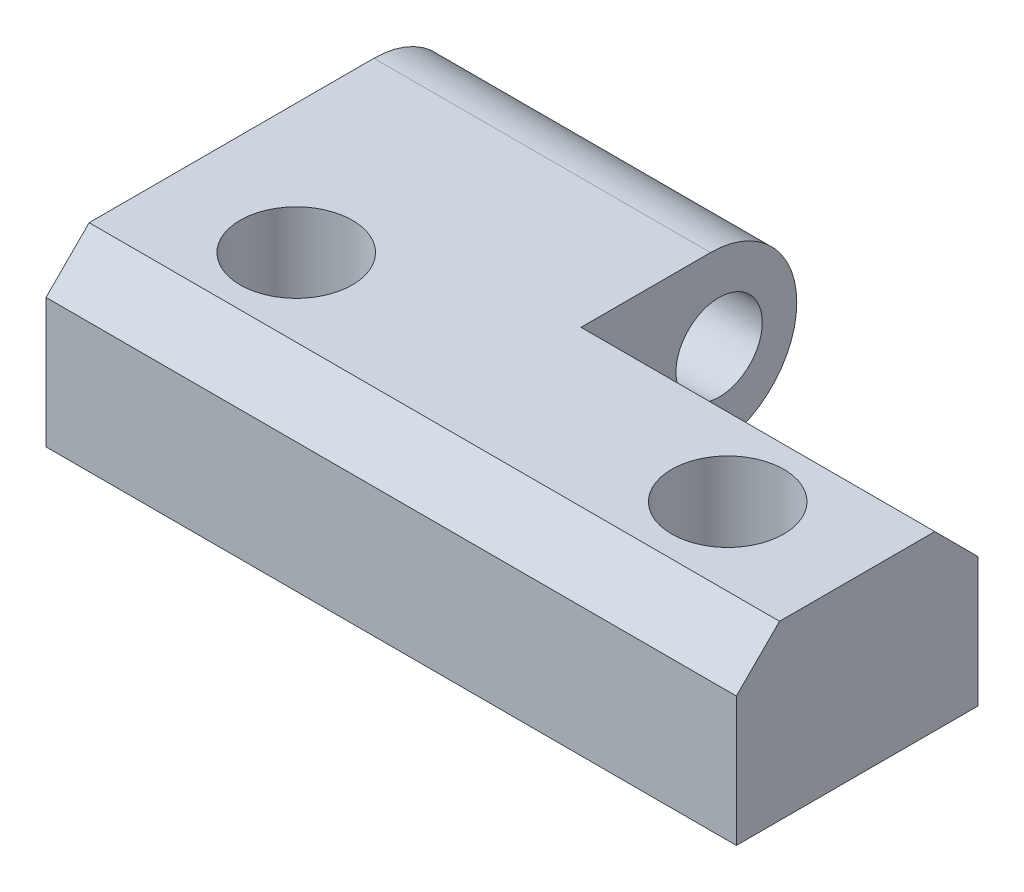
ISO-10303-21;
HEADER;
FILE_DESCRIPTION(('STEP AP214'),'2;1');
FILE_NAME('part.step','',(''),(''),'','','');
FILE_SCHEMA(('AUTOMOTIVE_DESIGN { 1 0 10303 214 1 1 1 1 }'));
ENDSEC;
DATA;
#1=APPLICATION_CONTEXT('core data for automotive mechanical design processes');
#2=APPLICATION_PROTOCOL_DEFINITION('international standard','automotive_design',2000,#1);
#3=PRODUCT_CONTEXT('',#1,'mechanical');
#4=PRODUCT('Part','Part','',(#3));
#5=PRODUCT_RELATED_PRODUCT_CATEGORY('part','',(#4));
#6=PRODUCT_DEFINITION_FORMATION('','',#4);
#7=PRODUCT_DEFINITION_CONTEXT('part definition',#1,'design');
#8=PRODUCT_DEFINITION('design','',#6,#7);
#9=PRODUCT_DEFINITION_SHAPE('','',#8);
#10=(LENGTH_UNIT() NAMED_UNIT(*) SI_UNIT(.MILLI.,.METRE.));
#11=(NAMED_UNIT(*) PLANE_ANGLE_UNIT() SI_UNIT($,.RADIAN.));
#12=(NAMED_UNIT(*) SI_UNIT($,.STERADIAN.) SOLID_ANGLE_UNIT());
#13=UNCERTAINTY_MEASURE_WITH_UNIT(LENGTH_MEASURE(1.E-05),#10,'distance_accuracy_value','');
#14=(GEOMETRIC_REPRESENTATION_CONTEXT(3) GLOBAL_UNCERTAINTY_ASSIGNED_CONTEXT((#13)) GLOBAL_UNIT_ASSIGNED_CONTEXT((#10,
#11,#12)) REPRESENTATION_CONTEXT('',''));
#15=CARTESIAN_POINT('',(0.,0.,0.));
#16=DIRECTION('',(0.,0.,1.));
#17=DIRECTION('',(1.,0.,0.));
#18=AXIS2_PLACEMENT_3D('',#15,#16,#17);
#19=CARTESIAN_POINT('',(0.,10.,0.));
#20=DIRECTION('',(0.,1.,0.));
#21=DIRECTION('',(0.,0.,1.));
#22=AXIS2_PLACEMENT_3D('',#19,#20,#21);
#23=PLANE('',#22);
#24=CARTESIAN_POINT('',(-25.,10.,10.));
#25=DIRECTION('',(0.,1.,0.));
#26=DIRECTION('',(0.,0.,1.));
#27=AXIS2_PLACEMENT_3D('',#24,#25,#26);
#28=CIRCLE('',#27,6.5);
#29=CARTESIAN_POINT('',(-25.,10.,16.5));
#30=VERTEX_POINT('',#29);
#31=EDGE_CURVE('E139',#30,#30,#28,.T.);
#32=ORIENTED_EDGE('',*,*,#31,.F.);
#33=EDGE_LOOP('',(#32));
#34=FACE_BOUND('',#33,.T.);
#35=CARTESIAN_POINT('',(25.,10.,10.));
#36=DIRECTION('',(0.,1.,0.));
#37=DIRECTION('',(0.,0.,1.));
#38=AXIS2_PLACEMENT_3D('',#35,#36,#37);
#39=CIRCLE('',#38,6.5);
#40=CARTESIAN_POINT('',(25.,10.,16.5));
#41=VERTEX_POINT('',#40);
#42=EDGE_CURVE('E326',#41,#41,#39,.T.);
#43=ORIENTED_EDGE('',*,*,#42,.F.);
#44=EDGE_LOOP('',(#43));
#45=FACE_BOUND('',#44,.T.);
#46=DIRECTION('',(0.,0.,-1.));
#47=VECTOR('',#46,1.);
#48=CARTESIAN_POINT('',(40.,10.,24.));
#49=LINE('',#48,#47);
#50=CARTESIAN_POINT('',(40.,10.,19.));
#51=VERTEX_POINT('',#50);
#52=CARTESIAN_POINT('',(40.,10.,1.00000000000001));
#53=VERTEX_POINT('',#52);
#54=EDGE_CURVE('E182',#51,#53,#49,.T.);
#55=ORIENTED_EDGE('',*,*,#54,.T.);
#56=DIRECTION('',(-1.,0.,0.));
#57=VECTOR('',#56,1.);
#58=CARTESIAN_POINT('',(-1.,10.,1.00000000000001));
#59=LINE('',#58,#57);
#60=CARTESIAN_POINT('',(-1.,10.,1.00000000000001));
#61=VERTEX_POINT('',#60);
#62=EDGE_CURVE('E168',#53,#61,#59,.T.);
#63=ORIENTED_EDGE('',*,*,#62,.T.);
#64=DIRECTION('',(0.,0.,-1.));
#65=VECTOR('',#64,1.);
#66=CARTESIAN_POINT('',(-1.,10.,-3.99999999999999));
#67=LINE('',#66,#65);
#68=CARTESIAN_POINT('',(-1.,10.,-14.));
#69=VERTEX_POINT('',#68);
#70=EDGE_CURVE('E147',#61,#69,#67,.T.);
#71=ORIENTED_EDGE('',*,*,#70,.T.);
#72=DIRECTION('',(1.,0.,0.));
#73=VECTOR('',#72,1.);
#74=CARTESIAN_POINT('',(-40.,10.,-14.));
#75=LINE('',#74,#73);
#76=CARTESIAN_POINT('',(-40.,10.,-14.));
#77=VERTEX_POINT('',#76);
#78=EDGE_CURVE('E124',#77,#69,#75,.T.);
#79=ORIENTED_EDGE('',*,*,#78,.F.);
#80=DIRECTION('',(0.,0.,1.));
#81=VECTOR('',#80,1.);
#82=CARTESIAN_POINT('',(-40.,10.,-24.));
#83=LINE('',#82,#81);
#84=CARTESIAN_POINT('',(-40.,10.,19.));
#85=VERTEX_POINT('',#84);
#86=EDGE_CURVE('E133',#77,#85,#83,.T.);
#87=ORIENTED_EDGE('',*,*,#86,.T.);
#88=DIRECTION('',(1.,0.,0.));
#89=VECTOR('',#88,1.);
#90=CARTESIAN_POINT('',(40.,10.,19.));
#91=LINE('',#90,#89);
#92=EDGE_CURVE('E165',#85,#51,#91,.T.);
#93=ORIENTED_EDGE('',*,*,#92,.T.);
#94=EDGE_LOOP('',(#55,#63,#71,#79,#87,#93));
#95=FACE_BOUND('',#94,.T.);
#96=ADVANCED_FACE('F47',(#34,#45,#95),#23,.T.);
#97=CARTESIAN_POINT('',(0.,-10.,0.));
#98=DIRECTION('',(0.,1.,0.));
#99=DIRECTION('',(0.,0.,1.));
#100=AXIS2_PLACEMENT_3D('',#97,#98,#99);
#101=PLANE('',#100);
#102=CARTESIAN_POINT('',(25.,-10.,10.));
#103=DIRECTION('',(0.,1.,0.));
#104=DIRECTION('',(0.,0.,1.));
#105=AXIS2_PLACEMENT_3D('',#102,#103,#104);
#106=CIRCLE('',#105,6.5);
#107=CARTESIAN_POINT('',(25.,-10.,16.5));
#108=VERTEX_POINT('',#107);
#109=EDGE_CURVE('E322',#108,#108,#106,.T.);
#110=ORIENTED_EDGE('',*,*,#109,.T.);
#111=EDGE_LOOP('',(#110));
#112=FACE_BOUND('',#111,.T.);
#113=CARTESIAN_POINT('',(-25.,-10.,10.));
#114=DIRECTION('',(0.,1.,0.));
#115=DIRECTION('',(0.,0.,1.));
#116=AXIS2_PLACEMENT_3D('',#113,#114,#115);
#117=CIRCLE('',#116,6.5);
#118=CARTESIAN_POINT('',(-25.,-10.,16.5));
#119=VERTEX_POINT('',#118);
#120=EDGE_CURVE('E144',#119,#119,#117,.T.);
#121=ORIENTED_EDGE('',*,*,#120,.T.);
#122=EDGE_LOOP('',(#121));
#123=FACE_BOUND('',#122,.T.);
#124=DIRECTION('',(1.,0.,0.));
#125=VECTOR('',#124,1.);
#126=CARTESIAN_POINT('',(-40.,-9.99999999999999,-14.));
#127=LINE('',#126,#125);
#128=CARTESIAN_POINT('',(-40.,-9.99999999999999,-14.));
#129=VERTEX_POINT('',#128);
#130=CARTESIAN_POINT('',(-1.,-9.99999999999999,-14.));
#131=VERTEX_POINT('',#130);
#132=EDGE_CURVE('E113',#129,#131,#127,.T.);
#133=ORIENTED_EDGE('',*,*,#132,.T.);
#134=DIRECTION('',(0.,0.,-1.));
#135=VECTOR('',#134,1.);
#136=CARTESIAN_POINT('',(-1.,-10.,-3.99999999999999));
#137=LINE('',#136,#135);
#138=CARTESIAN_POINT('',(-1.,-10.,-3.99999999999999));
#139=VERTEX_POINT('',#138);
#140=EDGE_CURVE('E155',#139,#131,#137,.T.);
#141=ORIENTED_EDGE('',*,*,#140,.F.);
#142=DIRECTION('',(-1.,0.,0.));
#143=VECTOR('',#142,1.);
#144=CARTESIAN_POINT('',(40.,-10.,-3.99999999999999));
#145=LINE('',#144,#143);
#146=CARTESIAN_POINT('',(40.,-10.,-3.99999999999999));
#147=VERTEX_POINT('',#146);
#148=EDGE_CURVE('E152',#147,#139,#145,.T.);
#149=ORIENTED_EDGE('',*,*,#148,.F.);
#150=DIRECTION('',(0.,0.,-1.));
#151=VECTOR('',#150,1.);
#152=CARTESIAN_POINT('',(40.,-10.,24.));
#153=LINE('',#152,#151);
#154=CARTESIAN_POINT('',(40.,-10.,24.));
#155=VERTEX_POINT('',#154);
#156=EDGE_CURVE('E141',#155,#147,#153,.T.);
#157=ORIENTED_EDGE('',*,*,#156,.F.);
#158=DIRECTION('',(1.,0.,0.));
#159=VECTOR('',#158,1.);
#160=CARTESIAN_POINT('',(-40.,-10.,24.));
#161=LINE('',#160,#159);
#162=CARTESIAN_POINT('',(-40.,-10.,24.));
#163=VERTEX_POINT('',#162);
#164=EDGE_CURVE('E138',#163,#155,#161,.T.);
#165=ORIENTED_EDGE('',*,*,#164,.F.);
#166=DIRECTION('',(0.,0.,1.));
#167=VECTOR('',#166,1.);
#168=CARTESIAN_POINT('',(-40.,-10.,-24.));
#169=LINE('',#168,#167);
#170=EDGE_CURVE('E130',#129,#163,#169,.T.);
#171=ORIENTED_EDGE('',*,*,#170,.F.);
#172=EDGE_LOOP('',(#133,#141,#149,#157,#165,#171));
#173=FACE_BOUND('',#172,.T.);
#174=ADVANCED_FACE('F135',(#112,#123,#173),#101,.F.);
#175=CARTESIAN_POINT('',(-40.,10.,-24.));
#176=DIRECTION('',(1.,0.,0.));
#177=DIRECTION('',(0.,0.,-1.));
#178=AXIS2_PLACEMENT_3D('',#175,#176,#177);
#179=PLANE('',#178);
#180=DIRECTION('',(0.,-1.,0.));
#181=VECTOR('',#180,1.);
#182=CARTESIAN_POINT('',(-40.,10.,24.));
#183=LINE('',#182,#181);
#184=CARTESIAN_POINT('',(-40.,4.99999999999998,24.));
#185=VERTEX_POINT('',#184);
#186=EDGE_CURVE('E163',#185,#163,#183,.T.);
#187=ORIENTED_EDGE('',*,*,#186,.F.);
#188=DIRECTION('',(0.,0.707106781186549,-0.707106781186547));
#189=VECTOR('',#188,1.);
#190=CARTESIAN_POINT('',(-40.,10.,19.));
#191=LINE('',#190,#189);
#192=EDGE_CURVE('E55',#185,#85,#191,.T.);
#193=ORIENTED_EDGE('',*,*,#192,.T.);
#194=ORIENTED_EDGE('',*,*,#86,.F.);
#195=CARTESIAN_POINT('',(-40.,0.,-14.));
#196=DIRECTION('',(-1.,0.,0.));
#197=DIRECTION('',(0.,0.,-1.));
#198=AXIS2_PLACEMENT_3D('',#195,#196,#197);
#199=CIRCLE('',#198,10.);
#200=EDGE_CURVE('E117',#77,#129,#199,.T.);
#201=ORIENTED_EDGE('',*,*,#200,.T.);
#202=ORIENTED_EDGE('',*,*,#170,.T.);
#203=EDGE_LOOP('',(#187,#193,#194,#201,#202));
#204=FACE_BOUND('',#203,.T.);
#205=ADVANCED_FACE('F129',(#204),#179,.F.);
#206=CARTESIAN_POINT('',(-40.,10.,24.));
#207=DIRECTION('',(0.,0.,-1.));
#208=DIRECTION('',(-1.,0.,0.));
#209=AXIS2_PLACEMENT_3D('',#206,#207,#208);
#210=PLANE('',#209);
#211=DIRECTION('',(0.,-1.,0.));
#212=VECTOR('',#211,1.);
#213=CARTESIAN_POINT('',(40.,10.,24.));
#214=LINE('',#213,#212);
#215=CARTESIAN_POINT('',(40.,4.99999999999998,24.));
#216=VERTEX_POINT('',#215);
#217=EDGE_CURVE('E161',#216,#155,#214,.T.);
#218=ORIENTED_EDGE('',*,*,#217,.F.);
#219=DIRECTION('',(-1.,0.,0.));
#220=VECTOR('',#219,1.);
#221=CARTESIAN_POINT('',(-40.,4.99999999999998,24.));
#222=LINE('',#221,#220);
#223=EDGE_CURVE('E62',#216,#185,#222,.T.);
#224=ORIENTED_EDGE('',*,*,#223,.T.);
#225=ORIENTED_EDGE('',*,*,#186,.T.);
#226=ORIENTED_EDGE('',*,*,#164,.T.);
#227=EDGE_LOOP('',(#218,#224,#225,#226));
#228=FACE_BOUND('',#227,.T.);
#229=ADVANCED_FACE('F215',(#228),#210,.F.);
#230=CARTESIAN_POINT('',(40.,10.,24.));
#231=DIRECTION('',(-1.,0.,0.));
#232=DIRECTION('',(0.,0.,1.));
#233=AXIS2_PLACEMENT_3D('',#230,#231,#232);
#234=PLANE('',#233);
#235=DIRECTION('',(0.,-1.,0.));
#236=VECTOR('',#235,1.);
#237=CARTESIAN_POINT('',(40.,10.,-3.99999999999999));
#238=LINE('',#237,#236);
#239=CARTESIAN_POINT('',(40.,4.99999999999998,-3.99999999999999));
#240=VERTEX_POINT('',#239);
#241=EDGE_CURVE('E159',#240,#147,#238,.T.);
#242=ORIENTED_EDGE('',*,*,#241,.F.);
#243=DIRECTION('',(0.,0.707106781186549,0.707106781186547));
#244=VECTOR('',#243,1.);
#245=CARTESIAN_POINT('',(40.,10.,1.00000000000001));
#246=LINE('',#245,#244);
#247=EDGE_CURVE('E174',#240,#53,#246,.T.);
#248=ORIENTED_EDGE('',*,*,#247,.T.);
#249=ORIENTED_EDGE('',*,*,#54,.F.);
#250=DIRECTION('',(0.,-0.707106781186549,0.707106781186547));
#251=VECTOR('',#250,1.);
#252=CARTESIAN_POINT('',(40.,10.,19.));
#253=LINE('',#252,#251);
#254=EDGE_CURVE('E70',#51,#216,#253,.T.);
#255=ORIENTED_EDGE('',*,*,#254,.T.);
#256=ORIENTED_EDGE('',*,*,#217,.T.);
#257=ORIENTED_EDGE('',*,*,#156,.T.);
#258=EDGE_LOOP('',(#242,#248,#249,#255,#256,#257));
#259=FACE_BOUND('',#258,.T.);
#260=ADVANCED_FACE('F211',(#259),#234,.F.);
#261=CARTESIAN_POINT('',(40.,10.,-3.99999999999999));
#262=DIRECTION('',(0.,0.,1.));
#263=DIRECTION('',(1.,0.,0.));
#264=AXIS2_PLACEMENT_3D('',#261,#262,#263);
#265=PLANE('',#264);
#266=DIRECTION('',(0.,-1.,0.));
#267=VECTOR('',#266,1.);
#268=CARTESIAN_POINT('',(-1.,10.,-3.99999999999999));
#269=LINE('',#268,#267);
#270=CARTESIAN_POINT('',(-1.,4.99999999999998,-3.99999999999999));
#271=VERTEX_POINT('',#270);
#272=EDGE_CURVE('E157',#271,#139,#269,.T.);
#273=ORIENTED_EDGE('',*,*,#272,.F.);
#274=DIRECTION('',(1.,0.,0.));
#275=VECTOR('',#274,1.);
#276=CARTESIAN_POINT('',(40.,4.99999999999998,-3.99999999999999));
#277=LINE('',#276,#275);
#278=EDGE_CURVE('E171',#271,#240,#277,.T.);
#279=ORIENTED_EDGE('',*,*,#278,.T.);
#280=ORIENTED_EDGE('',*,*,#241,.T.);
#281=ORIENTED_EDGE('',*,*,#148,.T.);
#282=EDGE_LOOP('',(#273,#279,#280,#281));
#283=FACE_BOUND('',#282,.T.);
#284=ADVANCED_FACE('F207',(#283),#265,.F.);
#285=CARTESIAN_POINT('',(-1.,10.,-3.99999999999999));
#286=DIRECTION('',(-1.,0.,0.));
#287=DIRECTION('',(0.,0.,1.));
#288=AXIS2_PLACEMENT_3D('',#285,#286,#287);
#289=PLANE('',#288);
#290=CARTESIAN_POINT('',(-1.,0.,-15.));
#291=DIRECTION('',(1.,0.,0.));
#292=DIRECTION('',(0.,0.,-1.));
#293=AXIS2_PLACEMENT_3D('',#290,#291,#292);
#294=CIRCLE('',#293,4.99999999999999);
#295=CARTESIAN_POINT('',(-1.,0.,-20.));
#296=VERTEX_POINT('',#295);
#297=EDGE_CURVE('E320',#296,#296,#294,.T.);
#298=ORIENTED_EDGE('',*,*,#297,.F.);
#299=EDGE_LOOP('',(#298));
#300=FACE_BOUND('',#299,.T.);
#301=ORIENTED_EDGE('',*,*,#140,.T.);
#302=CARTESIAN_POINT('',(-1.,0.,-14.));
#303=DIRECTION('',(-1.,0.,0.));
#304=DIRECTION('',(0.,0.,-1.));
#305=AXIS2_PLACEMENT_3D('',#302,#303,#304);
#306=CIRCLE('',#305,10.);
#307=EDGE_CURVE('E119',#69,#131,#306,.T.);
#308=ORIENTED_EDGE('',*,*,#307,.F.);
#309=ORIENTED_EDGE('',*,*,#70,.F.);
#310=DIRECTION('',(0.,-0.707106781186549,-0.707106781186547));
#311=VECTOR('',#310,1.);
#312=CARTESIAN_POINT('',(-1.,7.5,-1.49999999999998));
#313=LINE('',#312,#311);
#314=EDGE_CURVE('E13',#61,#271,#313,.T.);
#315=ORIENTED_EDGE('',*,*,#314,.T.);
#316=ORIENTED_EDGE('',*,*,#272,.T.);
#317=EDGE_LOOP('',(#301,#308,#309,#315,#316));
#318=FACE_BOUND('',#317,.T.);
#319=ADVANCED_FACE('F204',(#300,#318),#289,.F.);
#320=CARTESIAN_POINT('',(-25.,10.,10.));
#321=DIRECTION('',(0.,-1.,0.));
#322=DIRECTION('',(0.,0.,-1.));
#323=AXIS2_PLACEMENT_3D('',#320,#321,#322);
#324=CYLINDRICAL_SURFACE('',#323,6.5);
#325=ORIENTED_EDGE('',*,*,#31,.T.);
#326=EDGE_LOOP('',(#325));
#327=FACE_BOUND('',#326,.T.);
#328=ORIENTED_EDGE('',*,*,#120,.F.);
#329=EDGE_LOOP('',(#328));
#330=FACE_BOUND('',#329,.T.);
#331=ADVANCED_FACE('F201',(#327,#330),#324,.F.);
#332=CARTESIAN_POINT('',(25.,10.,10.));
#333=DIRECTION('',(0.,-1.,0.));
#334=DIRECTION('',(0.,0.,-1.));
#335=AXIS2_PLACEMENT_3D('',#332,#333,#334);
#336=CYLINDRICAL_SURFACE('',#335,6.5);
#337=ORIENTED_EDGE('',*,*,#42,.T.);
#338=EDGE_LOOP('',(#337));
#339=FACE_BOUND('',#338,.T.);
#340=ORIENTED_EDGE('',*,*,#109,.F.);
#341=EDGE_LOOP('',(#340));
#342=FACE_BOUND('',#341,.T.);
#343=ADVANCED_FACE('F246',(#339,#342),#336,.F.);
#344=CARTESIAN_POINT('',(-23.,0.,-15.));
#345=DIRECTION('',(1.,0.,0.));
#346=DIRECTION('',(0.,0.,-1.));
#347=AXIS2_PLACEMENT_3D('',#344,#345,#346);
#348=CONICAL_SURFACE('',#347,4.99999999999999,1.02974425867665);
#349=CARTESIAN_POINT('',(-26.0043030951378,0.,-15.));
#350=VERTEX_POINT('',#349);
#351=VERTEX_LOOP('',#350);
#352=FACE_BOUND('',#351,.T.);
#353=CARTESIAN_POINT('',(-23.,0.,-15.));
#354=DIRECTION('',(1.,0.,0.));
#355=DIRECTION('',(0.,0.,-1.));
#356=AXIS2_PLACEMENT_3D('',#353,#354,#355);
#357=CIRCLE('',#356,4.99999999999999);
#358=CARTESIAN_POINT('',(-23.,0.,-20.));
#359=VERTEX_POINT('',#358);
#360=EDGE_CURVE('E317',#359,#359,#357,.T.);
#361=ORIENTED_EDGE('',*,*,#360,.T.);
#362=EDGE_LOOP('',(#361));
#363=FACE_BOUND('',#362,.T.);
#364=ADVANCED_FACE('F253',(#352,#363),#348,.F.);
#365=CARTESIAN_POINT('',(-1.,0.,-15.));
#366=DIRECTION('',(1.,0.,0.));
#367=DIRECTION('',(0.,0.,-1.));
#368=AXIS2_PLACEMENT_3D('',#365,#366,#367);
#369=CYLINDRICAL_SURFACE('',#368,4.99999999999999);
#370=ORIENTED_EDGE('',*,*,#360,.F.);
#371=EDGE_LOOP('',(#370));
#372=FACE_BOUND('',#371,.T.);
#373=ORIENTED_EDGE('',*,*,#297,.T.);
#374=EDGE_LOOP('',(#373));
#375=FACE_BOUND('',#374,.T.);
#376=ADVANCED_FACE('F260',(#372,#375),#369,.F.);
#377=CARTESIAN_POINT('',(-40.,0.,-14.));
#378=DIRECTION('',(1.,0.,0.));
#379=DIRECTION('',(0.,0.,-1.));
#380=AXIS2_PLACEMENT_3D('',#377,#378,#379);
#381=CYLINDRICAL_SURFACE('',#380,10.);
#382=ORIENTED_EDGE('',*,*,#307,.T.);
#383=ORIENTED_EDGE('',*,*,#132,.F.);
#384=ORIENTED_EDGE('',*,*,#200,.F.);
#385=ORIENTED_EDGE('',*,*,#78,.T.);
#386=EDGE_LOOP('',(#382,#383,#384,#385));
#387=FACE_BOUND('',#386,.T.);
#388=ADVANCED_FACE('F115',(#387),#381,.T.);
#389=CARTESIAN_POINT('',(0.,10.,1.00000000000001));
#390=DIRECTION('',(0.,0.707106781186547,-0.707106781186549));
#391=DIRECTION('',(1.,0.,0.));
#392=AXIS2_PLACEMENT_3D('',#389,#390,#391);
#393=PLANE('',#392);
#394=ORIENTED_EDGE('',*,*,#247,.F.);
#395=ORIENTED_EDGE('',*,*,#278,.F.);
#396=ORIENTED_EDGE('',*,*,#314,.F.);
#397=ORIENTED_EDGE('',*,*,#62,.F.);
#398=EDGE_LOOP('',(#394,#395,#396,#397));
#399=FACE_BOUND('',#398,.T.);
#400=ADVANCED_FACE('F185',(#399),#393,.T.);
#401=CARTESIAN_POINT('',(0.,10.,19.));
#402=DIRECTION('',(0.,0.707106781186547,0.707106781186549));
#403=DIRECTION('',(-1.,0.,0.));
#404=AXIS2_PLACEMENT_3D('',#401,#402,#403);
#405=PLANE('',#404);
#406=ORIENTED_EDGE('',*,*,#192,.F.);
#407=ORIENTED_EDGE('',*,*,#223,.F.);
#408=ORIENTED_EDGE('',*,*,#254,.F.);
#409=ORIENTED_EDGE('',*,*,#92,.F.);
#410=EDGE_LOOP('',(#406,#407,#408,#409));
#411=FACE_BOUND('',#410,.T.);
#412=ADVANCED_FACE('F49',(#411),#405,.T.);
#413=CLOSED_SHELL('',(#96,#174,#205,#229,#260,#284,#319,#331,#343,#364,#376,#388,#400,#412));
#414=MANIFOLD_SOLID_BREP('B2',#413);
#415=ADVANCED_BREP_SHAPE_REPRESENTATION('',(#18,#414),#14);
#416=SHAPE_DEFINITION_REPRESENTATION(#9,#415);
ENDSEC;
END-ISO-10303-21;
